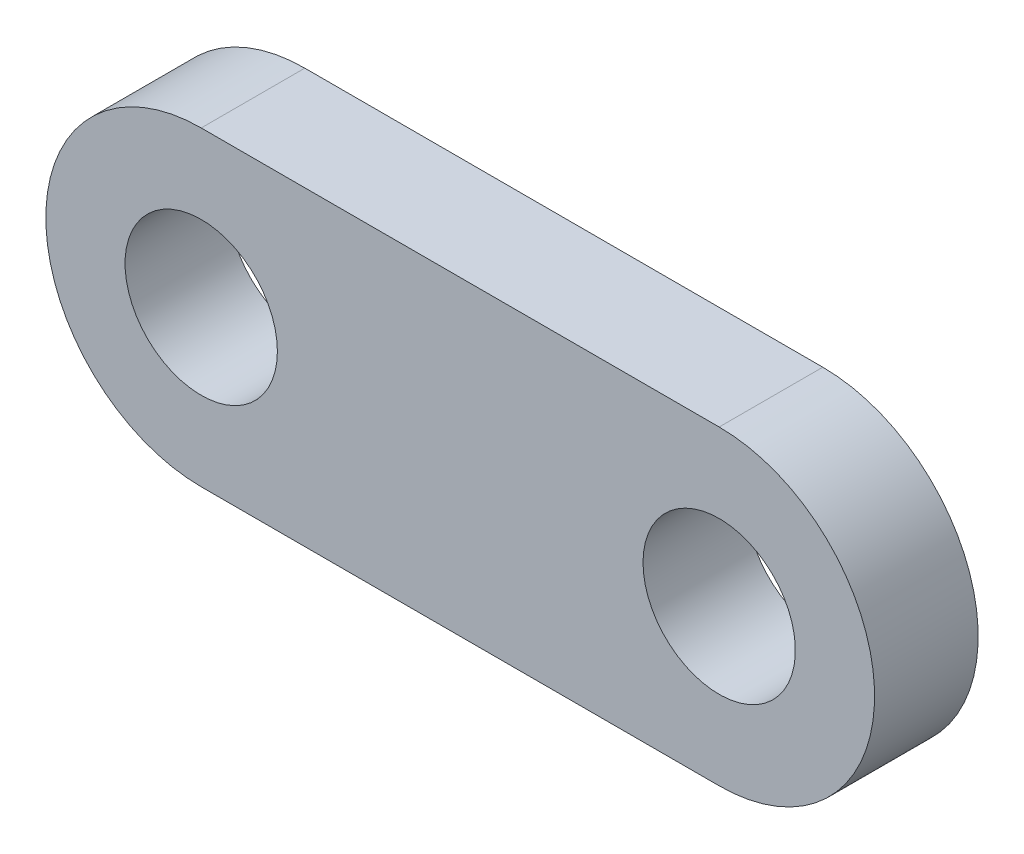
ISO-10303-21;
HEADER;
FILE_DESCRIPTION(('STEP AP214'),'2;1');
FILE_NAME('part.step','',(''),(''),'','','');
FILE_SCHEMA(('AUTOMOTIVE_DESIGN { 1 0 10303 214 1 1 1 1 }'));
ENDSEC;
DATA;
#1=APPLICATION_CONTEXT('core data for automotive mechanical design processes');
#2=APPLICATION_PROTOCOL_DEFINITION('international standard','automotive_design',2000,#1);
#3=PRODUCT_CONTEXT('',#1,'mechanical');
#4=PRODUCT('Part','Part','',(#3));
#5=PRODUCT_RELATED_PRODUCT_CATEGORY('part','',(#4));
#6=PRODUCT_DEFINITION_FORMATION('','',#4);
#7=PRODUCT_DEFINITION_CONTEXT('part definition',#1,'design');
#8=PRODUCT_DEFINITION('design','',#6,#7);
#9=PRODUCT_DEFINITION_SHAPE('','',#8);
#10=(LENGTH_UNIT() NAMED_UNIT(*) SI_UNIT(.MILLI.,.METRE.));
#11=(NAMED_UNIT(*) PLANE_ANGLE_UNIT() SI_UNIT($,.RADIAN.));
#12=(NAMED_UNIT(*) SI_UNIT($,.STERADIAN.) SOLID_ANGLE_UNIT());
#13=UNCERTAINTY_MEASURE_WITH_UNIT(LENGTH_MEASURE(1.E-05),#10,'distance_accuracy_value','');
#14=(GEOMETRIC_REPRESENTATION_CONTEXT(3) GLOBAL_UNCERTAINTY_ASSIGNED_CONTEXT((#13)) GLOBAL_UNIT_ASSIGNED_CONTEXT((#10,
#11,#12)) REPRESENTATION_CONTEXT('',''));
#15=CARTESIAN_POINT('',(0.,0.,0.));
#16=DIRECTION('',(0.,0.,1.));
#17=DIRECTION('',(1.,0.,0.));
#18=AXIS2_PLACEMENT_3D('',#15,#16,#17);
#19=CARTESIAN_POINT('',(25.,-30.,10.));
#20=DIRECTION('',(0.,1.,0.));
#21=DIRECTION('',(-1.,0.,0.));
#22=AXIS2_PLACEMENT_3D('',#19,#20,#21);
#23=PLANE('',#22);
#24=DIRECTION('',(1.,0.,0.));
#25=VECTOR('',#24,1.);
#26=CARTESIAN_POINT('',(25.,-30.,0.));
#27=LINE('',#26,#25);
#28=CARTESIAN_POINT('',(-25.,-30.,0.));
#29=VERTEX_POINT('',#28);
#30=CARTESIAN_POINT('',(25.,-30.,0.));
#31=VERTEX_POINT('',#30);
#32=EDGE_CURVE('E68',#29,#31,#27,.T.);
#33=ORIENTED_EDGE('',*,*,#32,.T.);
#34=DIRECTION('',(0.,0.,-1.));
#35=VECTOR('',#34,1.);
#36=CARTESIAN_POINT('',(25.,-30.,10.));
#37=LINE('',#36,#35);
#38=CARTESIAN_POINT('',(25.,-30.,10.));
#39=VERTEX_POINT('',#38);
#40=EDGE_CURVE('E49',#39,#31,#37,.T.);
#41=ORIENTED_EDGE('',*,*,#40,.F.);
#42=DIRECTION('',(1.,0.,0.));
#43=VECTOR('',#42,1.);
#44=CARTESIAN_POINT('',(25.,-30.,10.));
#45=LINE('',#44,#43);
#46=CARTESIAN_POINT('',(-25.,-30.,10.));
#47=VERTEX_POINT('',#46);
#48=EDGE_CURVE('E84',#47,#39,#45,.T.);
#49=ORIENTED_EDGE('',*,*,#48,.F.);
#50=DIRECTION('',(0.,0.,-1.));
#51=VECTOR('',#50,1.);
#52=CARTESIAN_POINT('',(-25.,-30.,10.));
#53=LINE('',#52,#51);
#54=EDGE_CURVE('E11',#47,#29,#53,.T.);
#55=ORIENTED_EDGE('',*,*,#54,.T.);
#56=EDGE_LOOP('',(#33,#41,#49,#55));
#57=FACE_BOUND('',#56,.T.);
#58=ADVANCED_FACE('F41',(#57),#23,.F.);
#59=CARTESIAN_POINT('',(-25.,0.,10.));
#60=DIRECTION('',(0.,-1.,0.));
#61=DIRECTION('',(1.,0.,0.));
#62=AXIS2_PLACEMENT_3D('',#59,#60,#61);
#63=PLANE('',#62);
#64=DIRECTION('',(-1.,0.,0.));
#65=VECTOR('',#64,1.);
#66=CARTESIAN_POINT('',(-25.,0.,0.));
#67=LINE('',#66,#65);
#68=CARTESIAN_POINT('',(25.,0.,0.));
#69=VERTEX_POINT('',#68);
#70=CARTESIAN_POINT('',(-25.,0.,0.));
#71=VERTEX_POINT('',#70);
#72=EDGE_CURVE('E78',#69,#71,#67,.T.);
#73=ORIENTED_EDGE('',*,*,#72,.T.);
#74=DIRECTION('',(0.,0.,-1.));
#75=VECTOR('',#74,1.);
#76=CARTESIAN_POINT('',(-25.,0.,10.));
#77=LINE('',#76,#75);
#78=CARTESIAN_POINT('',(-25.,0.,10.));
#79=VERTEX_POINT('',#78);
#80=EDGE_CURVE('E106',#79,#71,#77,.T.);
#81=ORIENTED_EDGE('',*,*,#80,.F.);
#82=DIRECTION('',(-1.,0.,0.));
#83=VECTOR('',#82,1.);
#84=CARTESIAN_POINT('',(-25.,0.,10.));
#85=LINE('',#84,#83);
#86=CARTESIAN_POINT('',(25.,0.,10.));
#87=VERTEX_POINT('',#86);
#88=EDGE_CURVE('E57',#87,#79,#85,.T.);
#89=ORIENTED_EDGE('',*,*,#88,.F.);
#90=DIRECTION('',(0.,0.,-1.));
#91=VECTOR('',#90,1.);
#92=CARTESIAN_POINT('',(25.,0.,10.));
#93=LINE('',#92,#91);
#94=EDGE_CURVE('E94',#87,#69,#93,.T.);
#95=ORIENTED_EDGE('',*,*,#94,.T.);
#96=EDGE_LOOP('',(#73,#81,#89,#95));
#97=FACE_BOUND('',#96,.T.);
#98=ADVANCED_FACE('F112',(#97),#63,.F.);
#99=CARTESIAN_POINT('',(0.,0.,10.));
#100=DIRECTION('',(0.,0.,-1.));
#101=DIRECTION('',(-1.,0.,0.));
#102=AXIS2_PLACEMENT_3D('',#99,#100,#101);
#103=PLANE('',#102);
#104=CARTESIAN_POINT('',(-25.,-15.,10.));
#105=DIRECTION('',(0.,0.,1.));
#106=DIRECTION('',(1.,0.,0.));
#107=AXIS2_PLACEMENT_3D('',#104,#105,#106);
#108=CIRCLE('',#107,7.35354484473582);
#109=CARTESIAN_POINT('',(-17.6464551552642,-15.,10.));
#110=VERTEX_POINT('',#109);
#111=EDGE_CURVE('E118',#110,#110,#108,.T.);
#112=ORIENTED_EDGE('',*,*,#111,.F.);
#113=EDGE_LOOP('',(#112));
#114=FACE_BOUND('',#113,.T.);
#115=CARTESIAN_POINT('',(25.,-15.,10.));
#116=DIRECTION('',(0.,0.,1.));
#117=DIRECTION('',(-1.,0.,0.));
#118=AXIS2_PLACEMENT_3D('',#115,#116,#117);
#119=CIRCLE('',#118,7.35354484473582);
#120=CARTESIAN_POINT('',(17.6464551552642,-15.,10.));
#121=VERTEX_POINT('',#120);
#122=EDGE_CURVE('E124',#121,#121,#119,.T.);
#123=ORIENTED_EDGE('',*,*,#122,.F.);
#124=EDGE_LOOP('',(#123));
#125=FACE_BOUND('',#124,.T.);
#126=ORIENTED_EDGE('',*,*,#88,.T.);
#127=CARTESIAN_POINT('',(-25.,-15.,10.));
#128=DIRECTION('',(0.,0.,1.));
#129=DIRECTION('',(1.,0.,0.));
#130=AXIS2_PLACEMENT_3D('',#127,#128,#129);
#131=CIRCLE('',#130,15.);
#132=EDGE_CURVE('E89',#79,#47,#131,.T.);
#133=ORIENTED_EDGE('',*,*,#132,.T.);
#134=ORIENTED_EDGE('',*,*,#48,.T.);
#135=CARTESIAN_POINT('',(25.,-15.,10.));
#136=DIRECTION('',(0.,0.,1.));
#137=DIRECTION('',(1.,0.,0.));
#138=AXIS2_PLACEMENT_3D('',#135,#136,#137);
#139=CIRCLE('',#138,15.);
#140=EDGE_CURVE('E87',#39,#87,#139,.T.);
#141=ORIENTED_EDGE('',*,*,#140,.T.);
#142=EDGE_LOOP('',(#126,#133,#134,#141));
#143=FACE_BOUND('',#142,.T.);
#144=ADVANCED_FACE('F85',(#114,#125,#143),#103,.F.);
#145=CARTESIAN_POINT('',(0.,0.,0.));
#146=DIRECTION('',(0.,0.,-1.));
#147=DIRECTION('',(-1.,0.,0.));
#148=AXIS2_PLACEMENT_3D('',#145,#146,#147);
#149=PLANE('',#148);
#150=CARTESIAN_POINT('',(-25.,-15.,0.));
#151=DIRECTION('',(0.,0.,1.));
#152=DIRECTION('',(1.,0.,0.));
#153=AXIS2_PLACEMENT_3D('',#150,#151,#152);
#154=CIRCLE('',#153,7.35354484473582);
#155=CARTESIAN_POINT('',(-17.6464551552642,-15.,0.));
#156=VERTEX_POINT('',#155);
#157=EDGE_CURVE('E116',#156,#156,#154,.T.);
#158=ORIENTED_EDGE('',*,*,#157,.T.);
#159=EDGE_LOOP('',(#158));
#160=FACE_BOUND('',#159,.T.);
#161=CARTESIAN_POINT('',(25.,-15.,0.));
#162=DIRECTION('',(0.,0.,1.));
#163=DIRECTION('',(-1.,0.,0.));
#164=AXIS2_PLACEMENT_3D('',#161,#162,#163);
#165=CIRCLE('',#164,7.35354484473582);
#166=CARTESIAN_POINT('',(17.6464551552642,-15.,0.));
#167=VERTEX_POINT('',#166);
#168=EDGE_CURVE('E121',#167,#167,#165,.T.);
#169=ORIENTED_EDGE('',*,*,#168,.T.);
#170=EDGE_LOOP('',(#169));
#171=FACE_BOUND('',#170,.T.);
#172=ORIENTED_EDGE('',*,*,#32,.F.);
#173=CARTESIAN_POINT('',(-25.,-15.,0.));
#174=DIRECTION('',(0.,0.,1.));
#175=DIRECTION('',(1.,0.,0.));
#176=AXIS2_PLACEMENT_3D('',#173,#174,#175);
#177=CIRCLE('',#176,15.);
#178=EDGE_CURVE('E98',#71,#29,#177,.T.);
#179=ORIENTED_EDGE('',*,*,#178,.F.);
#180=ORIENTED_EDGE('',*,*,#72,.F.);
#181=CARTESIAN_POINT('',(25.,-15.,0.));
#182=DIRECTION('',(0.,0.,1.));
#183=DIRECTION('',(1.,0.,0.));
#184=AXIS2_PLACEMENT_3D('',#181,#182,#183);
#185=CIRCLE('',#184,15.);
#186=EDGE_CURVE('E97',#31,#69,#185,.T.);
#187=ORIENTED_EDGE('',*,*,#186,.F.);
#188=EDGE_LOOP('',(#172,#179,#180,#187));
#189=FACE_BOUND('',#188,.T.);
#190=ADVANCED_FACE('F113',(#160,#171,#189),#149,.T.);
#191=CARTESIAN_POINT('',(25.,-15.,0.));
#192=DIRECTION('',(0.,0.,1.));
#193=DIRECTION('',(1.,0.,0.));
#194=AXIS2_PLACEMENT_3D('',#191,#192,#193);
#195=CYLINDRICAL_SURFACE('',#194,15.);
#196=ORIENTED_EDGE('',*,*,#140,.F.);
#197=ORIENTED_EDGE('',*,*,#40,.T.);
#198=ORIENTED_EDGE('',*,*,#186,.T.);
#199=ORIENTED_EDGE('',*,*,#94,.F.);
#200=EDGE_LOOP('',(#196,#197,#198,#199));
#201=FACE_BOUND('',#200,.T.);
#202=ADVANCED_FACE('F96',(#201),#195,.T.);
#203=CARTESIAN_POINT('',(-25.,-15.,0.));
#204=DIRECTION('',(0.,0.,1.));
#205=DIRECTION('',(1.,0.,0.));
#206=AXIS2_PLACEMENT_3D('',#203,#204,#205);
#207=CYLINDRICAL_SURFACE('',#206,15.);
#208=ORIENTED_EDGE('',*,*,#132,.F.);
#209=ORIENTED_EDGE('',*,*,#80,.T.);
#210=ORIENTED_EDGE('',*,*,#178,.T.);
#211=ORIENTED_EDGE('',*,*,#54,.F.);
#212=EDGE_LOOP('',(#208,#209,#210,#211));
#213=FACE_BOUND('',#212,.T.);
#214=ADVANCED_FACE('F115',(#213),#207,.T.);
#215=CARTESIAN_POINT('',(25.,-15.,0.));
#216=DIRECTION('',(0.,0.,1.));
#217=DIRECTION('',(1.,0.,0.));
#218=AXIS2_PLACEMENT_3D('',#215,#216,#217);
#219=CYLINDRICAL_SURFACE('',#218,7.35354484473582);
#220=ORIENTED_EDGE('',*,*,#168,.F.);
#221=EDGE_LOOP('',(#220));
#222=FACE_BOUND('',#221,.T.);
#223=ORIENTED_EDGE('',*,*,#122,.T.);
#224=EDGE_LOOP('',(#223));
#225=FACE_BOUND('',#224,.T.);
#226=ADVANCED_FACE('F137',(#222,#225),#219,.F.);
#227=CARTESIAN_POINT('',(-25.,-15.,0.));
#228=DIRECTION('',(0.,0.,1.));
#229=DIRECTION('',(1.,0.,0.));
#230=AXIS2_PLACEMENT_3D('',#227,#228,#229);
#231=CYLINDRICAL_SURFACE('',#230,7.35354484473582);
#232=ORIENTED_EDGE('',*,*,#157,.F.);
#233=EDGE_LOOP('',(#232));
#234=FACE_BOUND('',#233,.T.);
#235=ORIENTED_EDGE('',*,*,#111,.T.);
#236=EDGE_LOOP('',(#235));
#237=FACE_BOUND('',#236,.T.);
#238=ADVANCED_FACE('F130',(#234,#237),#231,.F.);
#239=CLOSED_SHELL('',(#58,#98,#144,#190,#202,#214,#226,#238));
#240=MANIFOLD_SOLID_BREP('B2',#239);
#241=ADVANCED_BREP_SHAPE_REPRESENTATION('',(#18,#240),#14);
#242=SHAPE_DEFINITION_REPRESENTATION(#9,#241);
ENDSEC;
END-ISO-10303-21;
